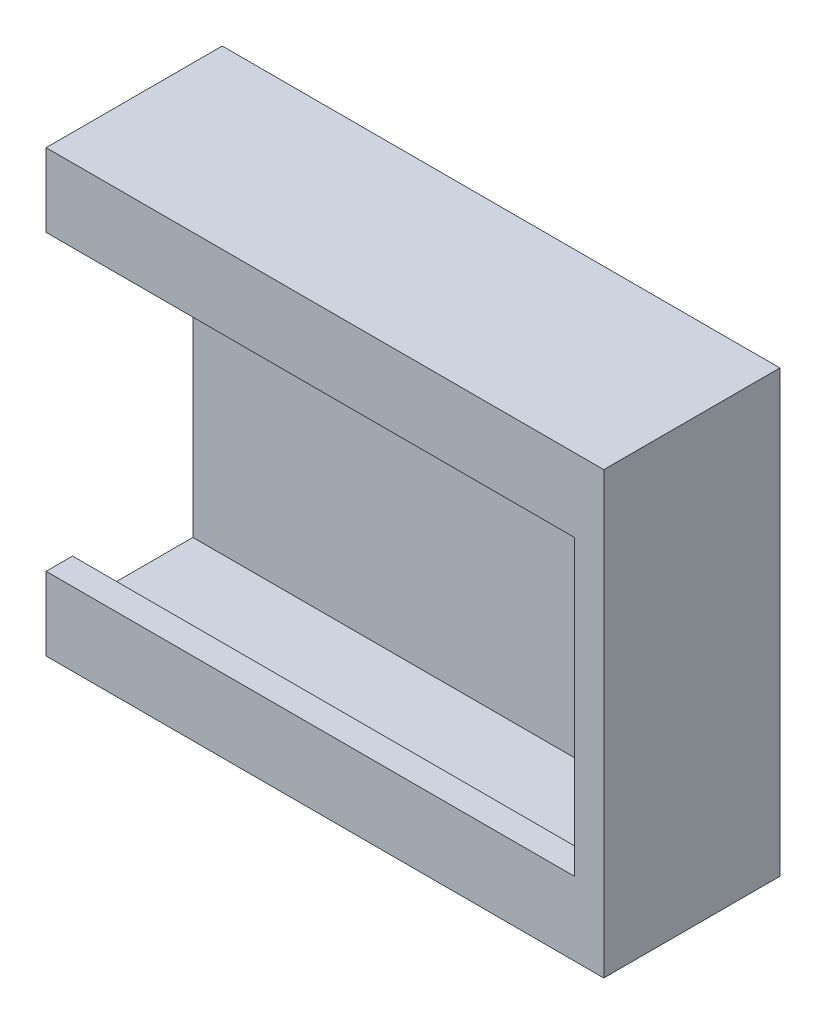
ISO-10303-21;
HEADER;
FILE_DESCRIPTION(('STEP AP214'),'2;1');
FILE_NAME('part.step','',(''),(''),'','','');
FILE_SCHEMA(('AUTOMOTIVE_DESIGN { 1 0 10303 214 1 1 1 1 }'));
ENDSEC;
DATA;
#1=APPLICATION_CONTEXT('core data for automotive mechanical design processes');
#2=APPLICATION_PROTOCOL_DEFINITION('international standard','automotive_design',2000,#1);
#3=PRODUCT_CONTEXT('',#1,'mechanical');
#4=PRODUCT('Part','Part','',(#3));
#5=PRODUCT_RELATED_PRODUCT_CATEGORY('part','',(#4));
#6=PRODUCT_DEFINITION_FORMATION('','',#4);
#7=PRODUCT_DEFINITION_CONTEXT('part definition',#1,'design');
#8=PRODUCT_DEFINITION('design','',#6,#7);
#9=PRODUCT_DEFINITION_SHAPE('','',#8);
#10=(LENGTH_UNIT() NAMED_UNIT(*) SI_UNIT(.MILLI.,.METRE.));
#11=(NAMED_UNIT(*) PLANE_ANGLE_UNIT() SI_UNIT($,.RADIAN.));
#12=(NAMED_UNIT(*) SI_UNIT($,.STERADIAN.) SOLID_ANGLE_UNIT());
#13=UNCERTAINTY_MEASURE_WITH_UNIT(LENGTH_MEASURE(1.E-05),#10,'distance_accuracy_value','');
#14=(GEOMETRIC_REPRESENTATION_CONTEXT(3) GLOBAL_UNCERTAINTY_ASSIGNED_CONTEXT((#13)) GLOBAL_UNIT_ASSIGNED_CONTEXT((#10,
#11,#12)) REPRESENTATION_CONTEXT('',''));
#15=CARTESIAN_POINT('',(0.,0.,0.));
#16=DIRECTION('',(0.,0.,1.));
#17=DIRECTION('',(1.,0.,0.));
#18=AXIS2_PLACEMENT_3D('',#15,#16,#17);
#19=CARTESIAN_POINT('',(90.,5.,30.));
#20=DIRECTION('',(1.,0.,0.));
#21=DIRECTION('',(0.,0.,-1.));
#22=AXIS2_PLACEMENT_3D('',#19,#20,#21);
#23=PLANE('',#22);
#24=DIRECTION('',(0.,-1.,0.));
#25=VECTOR('',#24,1.);
#26=CARTESIAN_POINT('',(90.,5.,25.5));
#27=LINE('',#26,#25);
#28=CARTESIAN_POINT('',(90.,12.5,25.5));
#29=VERTEX_POINT('',#28);
#30=CARTESIAN_POINT('',(90.,5.,25.5));
#31=VERTEX_POINT('',#30);
#32=EDGE_CURVE('E134',#29,#31,#27,.T.);
#33=ORIENTED_EDGE('',*,*,#32,.F.);
#34=DIRECTION('',(0.,0.,-1.));
#35=VECTOR('',#34,1.);
#36=CARTESIAN_POINT('',(90.,12.5,30.));
#37=LINE('',#36,#35);
#38=CARTESIAN_POINT('',(90.,12.5,30.));
#39=VERTEX_POINT('',#38);
#40=EDGE_CURVE('E141',#39,#29,#37,.T.);
#41=ORIENTED_EDGE('',*,*,#40,.F.);
#42=DIRECTION('',(0.,-1.,0.));
#43=VECTOR('',#42,1.);
#44=CARTESIAN_POINT('',(90.,5.,30.));
#45=LINE('',#44,#43);
#46=CARTESIAN_POINT('',(90.,62.5,30.));
#47=VERTEX_POINT('',#46);
#48=EDGE_CURVE('E180',#47,#39,#45,.T.);
#49=ORIENTED_EDGE('',*,*,#48,.F.);
#50=DIRECTION('',(0.,0.,1.));
#51=VECTOR('',#50,1.);
#52=CARTESIAN_POINT('',(90.,62.5,30.));
#53=LINE('',#52,#51);
#54=CARTESIAN_POINT('',(90.,62.5,25.5));
#55=VERTEX_POINT('',#54);
#56=EDGE_CURVE('E162',#55,#47,#53,.T.);
#57=ORIENTED_EDGE('',*,*,#56,.F.);
#58=DIRECTION('',(0.,-1.,0.));
#59=VECTOR('',#58,1.);
#60=CARTESIAN_POINT('',(90.,70.,25.5));
#61=LINE('',#60,#59);
#62=CARTESIAN_POINT('',(90.,70.,25.5));
#63=VERTEX_POINT('',#62);
#64=EDGE_CURVE('E159',#63,#55,#61,.T.);
#65=ORIENTED_EDGE('',*,*,#64,.F.);
#66=DIRECTION('',(0.,0.,-1.));
#67=VECTOR('',#66,1.);
#68=CARTESIAN_POINT('',(90.,70.,30.));
#69=LINE('',#68,#67);
#70=CARTESIAN_POINT('',(90.,70.,5.));
#71=VERTEX_POINT('',#70);
#72=EDGE_CURVE('E198',#63,#71,#69,.T.);
#73=ORIENTED_EDGE('',*,*,#72,.T.);
#74=DIRECTION('',(0.,-1.,0.));
#75=VECTOR('',#74,1.);
#76=CARTESIAN_POINT('',(90.,5.,5.));
#77=LINE('',#76,#75);
#78=CARTESIAN_POINT('',(90.,5.,5.));
#79=VERTEX_POINT('',#78);
#80=EDGE_CURVE('E193',#71,#79,#77,.T.);
#81=ORIENTED_EDGE('',*,*,#80,.T.);
#82=DIRECTION('',(0.,0.,-1.));
#83=VECTOR('',#82,1.);
#84=CARTESIAN_POINT('',(90.,5.,30.));
#85=LINE('',#84,#83);
#86=EDGE_CURVE('E52',#31,#79,#85,.T.);
#87=ORIENTED_EDGE('',*,*,#86,.F.);
#88=EDGE_LOOP('',(#33,#41,#49,#57,#65,#73,#81,#87));
#89=FACE_BOUND('',#88,.T.);
#90=ADVANCED_FACE('F37',(#89),#23,.F.);
#91=CARTESIAN_POINT('',(0.,5.,30.));
#92=DIRECTION('',(0.,-1.,0.));
#93=DIRECTION('',(0.,0.,-1.));
#94=AXIS2_PLACEMENT_3D('',#91,#92,#93);
#95=PLANE('',#94);
#96=DIRECTION('',(1.,0.,0.));
#97=VECTOR('',#96,1.);
#98=CARTESIAN_POINT('',(-8.74642784226798,4.99999999999995,25.5));
#99=LINE('',#98,#97);
#100=CARTESIAN_POINT('',(0.,4.99999999999995,25.5));
#101=VERTEX_POINT('',#100);
#102=EDGE_CURVE('E138',#101,#31,#99,.T.);
#103=ORIENTED_EDGE('',*,*,#102,.T.);
#104=ORIENTED_EDGE('',*,*,#86,.T.);
#105=DIRECTION('',(-1.,0.,0.));
#106=VECTOR('',#105,1.);
#107=CARTESIAN_POINT('',(0.,5.,5.));
#108=LINE('',#107,#106);
#109=CARTESIAN_POINT('',(0.,5.,5.));
#110=VERTEX_POINT('',#109);
#111=EDGE_CURVE('E178',#79,#110,#108,.T.);
#112=ORIENTED_EDGE('',*,*,#111,.T.);
#113=DIRECTION('',(0.,0.,-1.));
#114=VECTOR('',#113,1.);
#115=CARTESIAN_POINT('',(0.,5.,30.));
#116=LINE('',#115,#114);
#117=EDGE_CURVE('E60',#101,#110,#116,.T.);
#118=ORIENTED_EDGE('',*,*,#117,.F.);
#119=EDGE_LOOP('',(#103,#104,#112,#118));
#120=FACE_BOUND('',#119,.T.);
#121=ADVANCED_FACE('F254',(#120),#95,.F.);
#122=CARTESIAN_POINT('',(90.,70.,30.));
#123=DIRECTION('',(0.,1.,0.));
#124=DIRECTION('',(0.,0.,1.));
#125=AXIS2_PLACEMENT_3D('',#122,#123,#124);
#126=PLANE('',#125);
#127=DIRECTION('',(1.,0.,0.));
#128=VECTOR('',#127,1.);
#129=CARTESIAN_POINT('',(-8.74642784226802,69.9999999999999,25.5));
#130=LINE('',#129,#128);
#131=CARTESIAN_POINT('',(0.,70.,25.5));
#132=VERTEX_POINT('',#131);
#133=EDGE_CURVE('E170',#132,#63,#130,.T.);
#134=ORIENTED_EDGE('',*,*,#133,.F.);
#135=DIRECTION('',(0.,0.,-1.));
#136=VECTOR('',#135,1.);
#137=CARTESIAN_POINT('',(0.,70.,30.));
#138=LINE('',#137,#136);
#139=CARTESIAN_POINT('',(0.,70.,5.));
#140=VERTEX_POINT('',#139);
#141=EDGE_CURVE('E200',#132,#140,#138,.T.);
#142=ORIENTED_EDGE('',*,*,#141,.T.);
#143=DIRECTION('',(1.,0.,0.));
#144=VECTOR('',#143,1.);
#145=CARTESIAN_POINT('',(90.,70.,5.));
#146=LINE('',#145,#144);
#147=EDGE_CURVE('E157',#140,#71,#146,.T.);
#148=ORIENTED_EDGE('',*,*,#147,.T.);
#149=ORIENTED_EDGE('',*,*,#72,.F.);
#150=EDGE_LOOP('',(#134,#142,#148,#149));
#151=FACE_BOUND('',#150,.T.);
#152=ADVANCED_FACE('F249',(#151),#126,.F.);
#153=CARTESIAN_POINT('',(0.,0.,5.));
#154=DIRECTION('',(0.,0.,-1.));
#155=DIRECTION('',(-1.,0.,0.));
#156=AXIS2_PLACEMENT_3D('',#153,#154,#155);
#157=PLANE('',#156);
#158=ORIENTED_EDGE('',*,*,#111,.F.);
#159=ORIENTED_EDGE('',*,*,#80,.F.);
#160=ORIENTED_EDGE('',*,*,#147,.F.);
#161=DIRECTION('',(0.,-1.,0.));
#162=VECTOR('',#161,1.);
#163=CARTESIAN_POINT('',(0.,0.,5.));
#164=LINE('',#163,#162);
#165=EDGE_CURVE('E203',#140,#110,#164,.T.);
#166=ORIENTED_EDGE('',*,*,#165,.T.);
#167=EDGE_LOOP('',(#158,#159,#160,#166));
#168=FACE_BOUND('',#167,.T.);
#169=ADVANCED_FACE('F252',(#168),#157,.F.);
#170=CARTESIAN_POINT('',(0.,0.,5.));
#171=DIRECTION('',(1.,0.,0.));
#172=DIRECTION('',(0.,0.,-1.));
#173=AXIS2_PLACEMENT_3D('',#170,#171,#172);
#174=PLANE('',#173);
#175=DIRECTION('',(0.,-1.,0.));
#176=VECTOR('',#175,1.);
#177=CARTESIAN_POINT('',(0.,0.,0.));
#178=LINE('',#177,#176);
#179=CARTESIAN_POINT('',(0.,75.,0.));
#180=VERTEX_POINT('',#179);
#181=CARTESIAN_POINT('',(0.,0.,0.));
#182=VERTEX_POINT('',#181);
#183=EDGE_CURVE('E202',#180,#182,#178,.T.);
#184=ORIENTED_EDGE('',*,*,#183,.T.);
#185=DIRECTION('',(0.,0.,-1.));
#186=VECTOR('',#185,1.);
#187=CARTESIAN_POINT('',(0.,0.,5.));
#188=LINE('',#187,#186);
#189=CARTESIAN_POINT('',(0.,0.,30.));
#190=VERTEX_POINT('',#189);
#191=EDGE_CURVE('E11',#190,#182,#188,.T.);
#192=ORIENTED_EDGE('',*,*,#191,.F.);
#193=DIRECTION('',(0.,-1.,0.));
#194=VECTOR('',#193,1.);
#195=CARTESIAN_POINT('',(0.,0.,30.));
#196=LINE('',#195,#194);
#197=CARTESIAN_POINT('',(0.,12.5,30.));
#198=VERTEX_POINT('',#197);
#199=EDGE_CURVE('E182',#198,#190,#196,.T.);
#200=ORIENTED_EDGE('',*,*,#199,.F.);
#201=DIRECTION('',(0.,0.,1.));
#202=VECTOR('',#201,1.);
#203=CARTESIAN_POINT('',(0.,12.5,30.));
#204=LINE('',#203,#202);
#205=CARTESIAN_POINT('',(0.,12.5,25.5));
#206=VERTEX_POINT('',#205);
#207=EDGE_CURVE('E163',#206,#198,#204,.T.);
#208=ORIENTED_EDGE('',*,*,#207,.F.);
#209=DIRECTION('',(0.,1.,0.));
#210=VECTOR('',#209,1.);
#211=CARTESIAN_POINT('',(0.,4.99999999999995,25.5));
#212=LINE('',#211,#210);
#213=EDGE_CURVE('E135',#101,#206,#212,.T.);
#214=ORIENTED_EDGE('',*,*,#213,.F.);
#215=ORIENTED_EDGE('',*,*,#117,.T.);
#216=ORIENTED_EDGE('',*,*,#165,.F.);
#217=ORIENTED_EDGE('',*,*,#141,.F.);
#218=DIRECTION('',(0.,1.,0.));
#219=VECTOR('',#218,1.);
#220=CARTESIAN_POINT('',(0.,69.9999999999999,25.5));
#221=LINE('',#220,#219);
#222=CARTESIAN_POINT('',(0.,62.4999999999999,25.5));
#223=VERTEX_POINT('',#222);
#224=EDGE_CURVE('E155',#223,#132,#221,.T.);
#225=ORIENTED_EDGE('',*,*,#224,.F.);
#226=DIRECTION('',(0.,0.,-1.));
#227=VECTOR('',#226,1.);
#228=CARTESIAN_POINT('',(0.,62.4999999999999,30.));
#229=LINE('',#228,#227);
#230=CARTESIAN_POINT('',(0.,62.4999999999999,30.));
#231=VERTEX_POINT('',#230);
#232=EDGE_CURVE('E158',#231,#223,#229,.T.);
#233=ORIENTED_EDGE('',*,*,#232,.F.);
#234=DIRECTION('',(0.,-1.,0.));
#235=VECTOR('',#234,1.);
#236=CARTESIAN_POINT('',(0.,70.,30.));
#237=LINE('',#236,#235);
#238=CARTESIAN_POINT('',(0.,75.,30.));
#239=VERTEX_POINT('',#238);
#240=EDGE_CURVE('E177',#239,#231,#237,.T.);
#241=ORIENTED_EDGE('',*,*,#240,.F.);
#242=DIRECTION('',(0.,0.,-1.));
#243=VECTOR('',#242,1.);
#244=CARTESIAN_POINT('',(0.,75.,5.));
#245=LINE('',#244,#243);
#246=EDGE_CURVE('E205',#239,#180,#245,.T.);
#247=ORIENTED_EDGE('',*,*,#246,.T.);
#248=EDGE_LOOP('',(#184,#192,#200,#208,#214,#215,#216,#217,#225,#233,#241,#247));
#249=FACE_BOUND('',#248,.T.);
#250=ADVANCED_FACE('F39',(#249),#174,.F.);
#251=CARTESIAN_POINT('',(0.,0.,5.));
#252=DIRECTION('',(0.,1.,0.));
#253=DIRECTION('',(0.,0.,1.));
#254=AXIS2_PLACEMENT_3D('',#251,#252,#253);
#255=PLANE('',#254);
#256=DIRECTION('',(1.,0.,0.));
#257=VECTOR('',#256,1.);
#258=CARTESIAN_POINT('',(0.,0.,0.));
#259=LINE('',#258,#257);
#260=CARTESIAN_POINT('',(95.,0.,0.));
#261=VERTEX_POINT('',#260);
#262=EDGE_CURVE('E209',#182,#261,#259,.T.);
#263=ORIENTED_EDGE('',*,*,#262,.T.);
#264=DIRECTION('',(0.,0.,-1.));
#265=VECTOR('',#264,1.);
#266=CARTESIAN_POINT('',(95.,0.,5.));
#267=LINE('',#266,#265);
#268=CARTESIAN_POINT('',(95.,0.,30.));
#269=VERTEX_POINT('',#268);
#270=EDGE_CURVE('E45',#269,#261,#267,.T.);
#271=ORIENTED_EDGE('',*,*,#270,.F.);
#272=DIRECTION('',(1.,0.,0.));
#273=VECTOR('',#272,1.);
#274=CARTESIAN_POINT('',(95.,0.,30.));
#275=LINE('',#274,#273);
#276=EDGE_CURVE('E185',#190,#269,#275,.T.);
#277=ORIENTED_EDGE('',*,*,#276,.F.);
#278=ORIENTED_EDGE('',*,*,#191,.T.);
#279=EDGE_LOOP('',(#263,#271,#277,#278));
#280=FACE_BOUND('',#279,.T.);
#281=ADVANCED_FACE('F237',(#280),#255,.F.);
#282=CARTESIAN_POINT('',(95.,0.,5.));
#283=DIRECTION('',(-1.,0.,0.));
#284=DIRECTION('',(0.,0.,1.));
#285=AXIS2_PLACEMENT_3D('',#282,#283,#284);
#286=PLANE('',#285);
#287=DIRECTION('',(0.,1.,0.));
#288=VECTOR('',#287,1.);
#289=CARTESIAN_POINT('',(95.,0.,0.));
#290=LINE('',#289,#288);
#291=CARTESIAN_POINT('',(95.,75.,0.));
#292=VERTEX_POINT('',#291);
#293=EDGE_CURVE('E211',#261,#292,#290,.T.);
#294=ORIENTED_EDGE('',*,*,#293,.T.);
#295=DIRECTION('',(0.,0.,-1.));
#296=VECTOR('',#295,1.);
#297=CARTESIAN_POINT('',(95.,75.,5.));
#298=LINE('',#297,#296);
#299=CARTESIAN_POINT('',(95.,75.,30.));
#300=VERTEX_POINT('',#299);
#301=EDGE_CURVE('E216',#300,#292,#298,.T.);
#302=ORIENTED_EDGE('',*,*,#301,.F.);
#303=DIRECTION('',(0.,1.,0.));
#304=VECTOR('',#303,1.);
#305=CARTESIAN_POINT('',(95.,75.,30.));
#306=LINE('',#305,#304);
#307=EDGE_CURVE('E188',#269,#300,#306,.T.);
#308=ORIENTED_EDGE('',*,*,#307,.F.);
#309=ORIENTED_EDGE('',*,*,#270,.T.);
#310=EDGE_LOOP('',(#294,#302,#308,#309));
#311=FACE_BOUND('',#310,.T.);
#312=ADVANCED_FACE('F222',(#311),#286,.F.);
#313=CARTESIAN_POINT('',(0.,75.,5.));
#314=DIRECTION('',(0.,-1.,0.));
#315=DIRECTION('',(0.,0.,-1.));
#316=AXIS2_PLACEMENT_3D('',#313,#314,#315);
#317=PLANE('',#316);
#318=DIRECTION('',(-1.,0.,0.));
#319=VECTOR('',#318,1.);
#320=CARTESIAN_POINT('',(0.,75.,0.));
#321=LINE('',#320,#319);
#322=EDGE_CURVE('E206',#292,#180,#321,.T.);
#323=ORIENTED_EDGE('',*,*,#322,.T.);
#324=ORIENTED_EDGE('',*,*,#246,.F.);
#325=DIRECTION('',(-1.,0.,0.));
#326=VECTOR('',#325,1.);
#327=CARTESIAN_POINT('',(0.,75.,30.));
#328=LINE('',#327,#326);
#329=EDGE_CURVE('E174',#300,#239,#328,.T.);
#330=ORIENTED_EDGE('',*,*,#329,.F.);
#331=ORIENTED_EDGE('',*,*,#301,.T.);
#332=EDGE_LOOP('',(#323,#324,#330,#331));
#333=FACE_BOUND('',#332,.T.);
#334=ADVANCED_FACE('F230',(#333),#317,.F.);
#335=CARTESIAN_POINT('',(0.,0.,0.));
#336=DIRECTION('',(0.,0.,-1.));
#337=DIRECTION('',(-1.,0.,0.));
#338=AXIS2_PLACEMENT_3D('',#335,#336,#337);
#339=PLANE('',#338);
#340=ORIENTED_EDGE('',*,*,#183,.F.);
#341=ORIENTED_EDGE('',*,*,#322,.F.);
#342=ORIENTED_EDGE('',*,*,#293,.F.);
#343=ORIENTED_EDGE('',*,*,#262,.F.);
#344=EDGE_LOOP('',(#340,#341,#342,#343));
#345=FACE_BOUND('',#344,.T.);
#346=ADVANCED_FACE('F228',(#345),#339,.T.);
#347=CARTESIAN_POINT('',(0.,0.,30.));
#348=DIRECTION('',(0.,0.,-1.));
#349=DIRECTION('',(-1.,0.,0.));
#350=AXIS2_PLACEMENT_3D('',#347,#348,#349);
#351=PLANE('',#350);
#352=ORIENTED_EDGE('',*,*,#48,.T.);
#353=DIRECTION('',(1.,0.,0.));
#354=VECTOR('',#353,1.);
#355=CARTESIAN_POINT('',(-8.74642784226799,12.4999999999999,30.));
#356=LINE('',#355,#354);
#357=EDGE_CURVE('E144',#198,#39,#356,.T.);
#358=ORIENTED_EDGE('',*,*,#357,.F.);
#359=ORIENTED_EDGE('',*,*,#199,.T.);
#360=ORIENTED_EDGE('',*,*,#276,.T.);
#361=ORIENTED_EDGE('',*,*,#307,.T.);
#362=ORIENTED_EDGE('',*,*,#329,.T.);
#363=ORIENTED_EDGE('',*,*,#240,.T.);
#364=DIRECTION('',(1.,0.,0.));
#365=VECTOR('',#364,1.);
#366=CARTESIAN_POINT('',(-8.74642784226801,62.4999999999999,30.));
#367=LINE('',#366,#365);
#368=EDGE_CURVE('E166',#231,#47,#367,.T.);
#369=ORIENTED_EDGE('',*,*,#368,.T.);
#370=EDGE_LOOP('',(#352,#358,#359,#360,#361,#362,#363,#369));
#371=FACE_BOUND('',#370,.T.);
#372=ADVANCED_FACE('F236',(#371),#351,.F.);
#373=CARTESIAN_POINT('',(-8.74642784226801,62.4999999999999,30.));
#374=DIRECTION('',(0.,1.,0.));
#375=DIRECTION('',(-1.,0.,0.));
#376=AXIS2_PLACEMENT_3D('',#373,#374,#375);
#377=PLANE('',#376);
#378=ORIENTED_EDGE('',*,*,#368,.F.);
#379=ORIENTED_EDGE('',*,*,#232,.T.);
#380=DIRECTION('',(1.,0.,0.));
#381=VECTOR('',#380,1.);
#382=CARTESIAN_POINT('',(-8.74642784226801,62.4999999999999,25.5));
#383=LINE('',#382,#381);
#384=EDGE_CURVE('E168',#223,#55,#383,.T.);
#385=ORIENTED_EDGE('',*,*,#384,.T.);
#386=ORIENTED_EDGE('',*,*,#56,.T.);
#387=EDGE_LOOP('',(#378,#379,#385,#386));
#388=FACE_BOUND('',#387,.T.);
#389=ADVANCED_FACE('F242',(#388),#377,.F.);
#390=CARTESIAN_POINT('',(-8.74642784226802,69.9999999999999,25.5));
#391=DIRECTION('',(0.,0.,1.));
#392=DIRECTION('',(1.,0.,0.));
#393=AXIS2_PLACEMENT_3D('',#390,#391,#392);
#394=PLANE('',#393);
#395=ORIENTED_EDGE('',*,*,#384,.F.);
#396=ORIENTED_EDGE('',*,*,#224,.T.);
#397=ORIENTED_EDGE('',*,*,#133,.T.);
#398=ORIENTED_EDGE('',*,*,#64,.T.);
#399=EDGE_LOOP('',(#395,#396,#397,#398));
#400=FACE_BOUND('',#399,.T.);
#401=ADVANCED_FACE('F245',(#400),#394,.F.);
#402=CARTESIAN_POINT('',(-8.74642784226798,4.99999999999995,25.5));
#403=DIRECTION('',(0.,0.,1.));
#404=DIRECTION('',(1.,0.,0.));
#405=AXIS2_PLACEMENT_3D('',#402,#403,#404);
#406=PLANE('',#405);
#407=ORIENTED_EDGE('',*,*,#102,.F.);
#408=ORIENTED_EDGE('',*,*,#213,.T.);
#409=DIRECTION('',(1.,0.,0.));
#410=VECTOR('',#409,1.);
#411=CARTESIAN_POINT('',(-8.74642784226799,12.4999999999999,25.5));
#412=LINE('',#411,#410);
#413=EDGE_CURVE('E129',#206,#29,#412,.T.);
#414=ORIENTED_EDGE('',*,*,#413,.T.);
#415=ORIENTED_EDGE('',*,*,#32,.T.);
#416=EDGE_LOOP('',(#407,#408,#414,#415));
#417=FACE_BOUND('',#416,.T.);
#418=ADVANCED_FACE('F132',(#417),#406,.F.);
#419=CARTESIAN_POINT('',(-8.74642784226799,12.4999999999999,30.));
#420=DIRECTION('',(0.,-1.,0.));
#421=DIRECTION('',(1.,0.,0.));
#422=AXIS2_PLACEMENT_3D('',#419,#420,#421);
#423=PLANE('',#422);
#424=ORIENTED_EDGE('',*,*,#413,.F.);
#425=ORIENTED_EDGE('',*,*,#207,.T.);
#426=ORIENTED_EDGE('',*,*,#357,.T.);
#427=ORIENTED_EDGE('',*,*,#40,.T.);
#428=EDGE_LOOP('',(#424,#425,#426,#427));
#429=FACE_BOUND('',#428,.T.);
#430=ADVANCED_FACE('F142',(#429),#423,.F.);
#431=CLOSED_SHELL('',(#90,#121,#152,#169,#250,#281,#312,#334,#346,#372,#389,#401,#418,#430));
#432=MANIFOLD_SOLID_BREP('B2',#431);
#433=ADVANCED_BREP_SHAPE_REPRESENTATION('',(#18,#432),#14);
#434=SHAPE_DEFINITION_REPRESENTATION(#9,#433);
ENDSEC;
END-ISO-10303-21;
